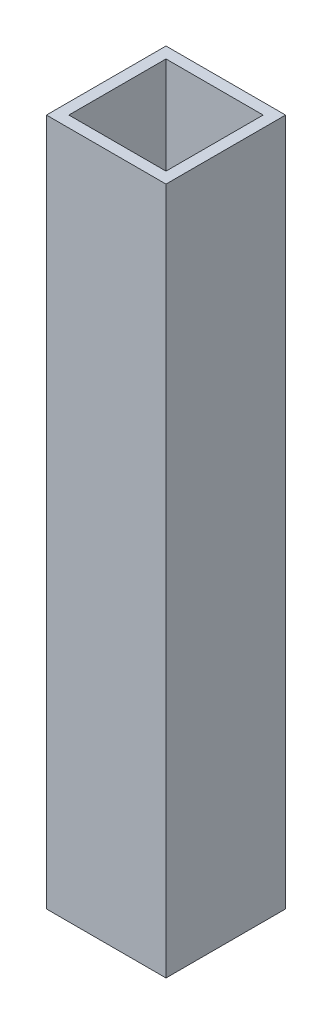
ISO-10303-21;
HEADER;
FILE_DESCRIPTION(('STEP AP214'),'2;1');
FILE_NAME('part.step','',(''),(''),'','','');
FILE_SCHEMA(('AUTOMOTIVE_DESIGN { 1 0 10303 214 1 1 1 1 }'));
ENDSEC;
DATA;
#1=APPLICATION_CONTEXT('core data for automotive mechanical design processes');
#2=APPLICATION_PROTOCOL_DEFINITION('international standard','automotive_design',2000,#1);
#3=PRODUCT_CONTEXT('',#1,'mechanical');
#4=PRODUCT('Part','Part','',(#3));
#5=PRODUCT_RELATED_PRODUCT_CATEGORY('part','',(#4));
#6=PRODUCT_DEFINITION_FORMATION('','',#4);
#7=PRODUCT_DEFINITION_CONTEXT('part definition',#1,'design');
#8=PRODUCT_DEFINITION('design','',#6,#7);
#9=PRODUCT_DEFINITION_SHAPE('','',#8);
#10=(LENGTH_UNIT() NAMED_UNIT(*) SI_UNIT(.MILLI.,.METRE.));
#11=(NAMED_UNIT(*) PLANE_ANGLE_UNIT() SI_UNIT($,.RADIAN.));
#12=(NAMED_UNIT(*) SI_UNIT($,.STERADIAN.) SOLID_ANGLE_UNIT());
#13=UNCERTAINTY_MEASURE_WITH_UNIT(LENGTH_MEASURE(1.E-05),#10,'distance_accuracy_value','');
#14=(GEOMETRIC_REPRESENTATION_CONTEXT(3) GLOBAL_UNCERTAINTY_ASSIGNED_CONTEXT((#13)) GLOBAL_UNIT_ASSIGNED_CONTEXT((#10,
#11,#12)) REPRESENTATION_CONTEXT('',''));
#15=CARTESIAN_POINT('',(0.,0.,0.));
#16=DIRECTION('',(0.,0.,1.));
#17=DIRECTION('',(1.,0.,0.));
#18=AXIS2_PLACEMENT_3D('',#15,#16,#17);
#19=CARTESIAN_POINT('',(25.4,146.05,50.8));
#20=DIRECTION('',(-1.,0.,0.));
#21=DIRECTION('',(0.,-1.,0.));
#22=AXIS2_PLACEMENT_3D('',#19,#20,#21);
#23=PLANE('',#22);
#24=DIRECTION('',(0.,1.,0.));
#25=VECTOR('',#24,1.);
#26=CARTESIAN_POINT('',(25.4,146.05,0.));
#27=LINE('',#26,#25);
#28=CARTESIAN_POINT('',(25.4,-146.05,0.));
#29=VERTEX_POINT('',#28);
#30=CARTESIAN_POINT('',(25.4,146.05,0.));
#31=VERTEX_POINT('',#30);
#32=EDGE_CURVE('E95',#29,#31,#27,.T.);
#33=ORIENTED_EDGE('',*,*,#32,.T.);
#34=DIRECTION('',(0.,0.,-1.));
#35=VECTOR('',#34,1.);
#36=CARTESIAN_POINT('',(25.4,146.05,50.8));
#37=LINE('',#36,#35);
#38=CARTESIAN_POINT('',(25.4,146.05,50.8));
#39=VERTEX_POINT('',#38);
#40=EDGE_CURVE('E11',#39,#31,#37,.T.);
#41=ORIENTED_EDGE('',*,*,#40,.F.);
#42=DIRECTION('',(0.,1.,0.));
#43=VECTOR('',#42,1.);
#44=CARTESIAN_POINT('',(25.4,146.05,50.8));
#45=LINE('',#44,#43);
#46=CARTESIAN_POINT('',(25.4,-146.05,50.8));
#47=VERTEX_POINT('',#46);
#48=EDGE_CURVE('E118',#47,#39,#45,.T.);
#49=ORIENTED_EDGE('',*,*,#48,.F.);
#50=DIRECTION('',(0.,0.,-1.));
#51=VECTOR('',#50,1.);
#52=CARTESIAN_POINT('',(25.4,-146.05,50.8));
#53=LINE('',#52,#51);
#54=EDGE_CURVE('E128',#47,#29,#53,.T.);
#55=ORIENTED_EDGE('',*,*,#54,.T.);
#56=EDGE_LOOP('',(#33,#41,#49,#55));
#57=FACE_BOUND('',#56,.T.);
#58=ADVANCED_FACE('F17',(#57),#23,.F.);
#59=CARTESIAN_POINT('',(-25.4,146.05,50.8));
#60=DIRECTION('',(0.,-1.,0.));
#61=DIRECTION('',(0.,0.,-1.));
#62=AXIS2_PLACEMENT_3D('',#59,#60,#61);
#63=PLANE('',#62);
#64=DIRECTION('',(0.,0.,-1.));
#65=VECTOR('',#64,1.);
#66=CARTESIAN_POINT('',(20.6375,146.05,46.0375));
#67=LINE('',#66,#65);
#68=CARTESIAN_POINT('',(20.6375,146.05,46.0375));
#69=VERTEX_POINT('',#68);
#70=CARTESIAN_POINT('',(20.6375,146.05,4.7625));
#71=VERTEX_POINT('',#70);
#72=EDGE_CURVE('E103',#69,#71,#67,.T.);
#73=ORIENTED_EDGE('',*,*,#72,.F.);
#74=DIRECTION('',(1.,0.,0.));
#75=VECTOR('',#74,1.);
#76=CARTESIAN_POINT('',(-20.6375,146.05,46.0375));
#77=LINE('',#76,#75);
#78=CARTESIAN_POINT('',(-20.6375,146.05,46.0375));
#79=VERTEX_POINT('',#78);
#80=EDGE_CURVE('E31',#79,#69,#77,.T.);
#81=ORIENTED_EDGE('',*,*,#80,.F.);
#82=DIRECTION('',(0.,0.,1.));
#83=VECTOR('',#82,1.);
#84=CARTESIAN_POINT('',(-20.6375,146.05,4.7625));
#85=LINE('',#84,#83);
#86=CARTESIAN_POINT('',(-20.6375,146.05,4.7625));
#87=VERTEX_POINT('',#86);
#88=EDGE_CURVE('E89',#87,#79,#85,.T.);
#89=ORIENTED_EDGE('',*,*,#88,.F.);
#90=DIRECTION('',(-1.,0.,0.));
#91=VECTOR('',#90,1.);
#92=CARTESIAN_POINT('',(20.6375,146.05,4.7625));
#93=LINE('',#92,#91);
#94=EDGE_CURVE('E109',#71,#87,#93,.T.);
#95=ORIENTED_EDGE('',*,*,#94,.F.);
#96=EDGE_LOOP('',(#73,#81,#89,#95));
#97=FACE_BOUND('',#96,.T.);
#98=DIRECTION('',(-1.,0.,0.));
#99=VECTOR('',#98,1.);
#100=CARTESIAN_POINT('',(-25.4,146.05,0.));
#101=LINE('',#100,#99);
#102=CARTESIAN_POINT('',(-25.4,146.05,0.));
#103=VERTEX_POINT('',#102);
#104=EDGE_CURVE('E131',#31,#103,#101,.T.);
#105=ORIENTED_EDGE('',*,*,#104,.T.);
#106=DIRECTION('',(0.,0.,-1.));
#107=VECTOR('',#106,1.);
#108=CARTESIAN_POINT('',(-25.4,146.05,50.8));
#109=LINE('',#108,#107);
#110=CARTESIAN_POINT('',(-25.4,146.05,50.8));
#111=VERTEX_POINT('',#110);
#112=EDGE_CURVE('E24',#111,#103,#109,.T.);
#113=ORIENTED_EDGE('',*,*,#112,.F.);
#114=DIRECTION('',(-1.,0.,0.));
#115=VECTOR('',#114,1.);
#116=CARTESIAN_POINT('',(-25.4,146.05,50.8));
#117=LINE('',#116,#115);
#118=EDGE_CURVE('E121',#39,#111,#117,.T.);
#119=ORIENTED_EDGE('',*,*,#118,.F.);
#120=ORIENTED_EDGE('',*,*,#40,.T.);
#121=EDGE_LOOP('',(#105,#113,#119,#120));
#122=FACE_BOUND('',#121,.T.);
#123=ADVANCED_FACE('F159',(#97,#122),#63,.F.);
#124=CARTESIAN_POINT('',(-25.4,146.05,50.8));
#125=DIRECTION('',(1.,0.,0.));
#126=DIRECTION('',(0.,1.,0.));
#127=AXIS2_PLACEMENT_3D('',#124,#125,#126);
#128=PLANE('',#127);
#129=DIRECTION('',(0.,-1.,0.));
#130=VECTOR('',#129,1.);
#131=CARTESIAN_POINT('',(-25.4,146.05,0.));
#132=LINE('',#131,#130);
#133=CARTESIAN_POINT('',(-25.4,-146.05,0.));
#134=VERTEX_POINT('',#133);
#135=EDGE_CURVE('E133',#103,#134,#132,.T.);
#136=ORIENTED_EDGE('',*,*,#135,.T.);
#137=DIRECTION('',(0.,0.,-1.));
#138=VECTOR('',#137,1.);
#139=CARTESIAN_POINT('',(-25.4,-146.05,50.8));
#140=LINE('',#139,#138);
#141=CARTESIAN_POINT('',(-25.4,-146.05,50.8));
#142=VERTEX_POINT('',#141);
#143=EDGE_CURVE('E138',#142,#134,#140,.T.);
#144=ORIENTED_EDGE('',*,*,#143,.F.);
#145=DIRECTION('',(0.,-1.,0.));
#146=VECTOR('',#145,1.);
#147=CARTESIAN_POINT('',(-25.4,146.05,50.8));
#148=LINE('',#147,#146);
#149=EDGE_CURVE('E124',#111,#142,#148,.T.);
#150=ORIENTED_EDGE('',*,*,#149,.F.);
#151=ORIENTED_EDGE('',*,*,#112,.T.);
#152=EDGE_LOOP('',(#136,#144,#150,#151));
#153=FACE_BOUND('',#152,.T.);
#154=ADVANCED_FACE('F145',(#153),#128,.F.);
#155=CARTESIAN_POINT('',(-25.4,-146.05,50.8));
#156=DIRECTION('',(0.,1.,0.));
#157=DIRECTION('',(0.,0.,1.));
#158=AXIS2_PLACEMENT_3D('',#155,#156,#157);
#159=PLANE('',#158);
#160=DIRECTION('',(0.,0.,-1.));
#161=VECTOR('',#160,1.);
#162=CARTESIAN_POINT('',(-20.6375,-146.05,4.7625));
#163=LINE('',#162,#161);
#164=CARTESIAN_POINT('',(-20.6375,-146.05,46.0375));
#165=VERTEX_POINT('',#164);
#166=CARTESIAN_POINT('',(-20.6375,-146.05,4.7625));
#167=VERTEX_POINT('',#166);
#168=EDGE_CURVE('E101',#165,#167,#163,.T.);
#169=ORIENTED_EDGE('',*,*,#168,.F.);
#170=DIRECTION('',(-1.,0.,0.));
#171=VECTOR('',#170,1.);
#172=CARTESIAN_POINT('',(-20.6375,-146.05,46.0375));
#173=LINE('',#172,#171);
#174=CARTESIAN_POINT('',(20.6375,-146.05,46.0375));
#175=VERTEX_POINT('',#174);
#176=EDGE_CURVE('E83',#175,#165,#173,.T.);
#177=ORIENTED_EDGE('',*,*,#176,.F.);
#178=DIRECTION('',(0.,0.,1.));
#179=VECTOR('',#178,1.);
#180=CARTESIAN_POINT('',(20.6375,-146.05,46.0375));
#181=LINE('',#180,#179);
#182=CARTESIAN_POINT('',(20.6375,-146.05,4.7625));
#183=VERTEX_POINT('',#182);
#184=EDGE_CURVE('E92',#183,#175,#181,.T.);
#185=ORIENTED_EDGE('',*,*,#184,.F.);
#186=DIRECTION('',(1.,0.,0.));
#187=VECTOR('',#186,1.);
#188=CARTESIAN_POINT('',(20.6375,-146.05,4.7625));
#189=LINE('',#188,#187);
#190=EDGE_CURVE('E39',#167,#183,#189,.T.);
#191=ORIENTED_EDGE('',*,*,#190,.F.);
#192=EDGE_LOOP('',(#169,#177,#185,#191));
#193=FACE_BOUND('',#192,.T.);
#194=DIRECTION('',(1.,0.,0.));
#195=VECTOR('',#194,1.);
#196=CARTESIAN_POINT('',(-25.4,-146.05,0.));
#197=LINE('',#196,#195);
#198=EDGE_CURVE('E122',#134,#29,#197,.T.);
#199=ORIENTED_EDGE('',*,*,#198,.T.);
#200=ORIENTED_EDGE('',*,*,#54,.F.);
#201=DIRECTION('',(1.,0.,0.));
#202=VECTOR('',#201,1.);
#203=CARTESIAN_POINT('',(-25.4,-146.05,50.8));
#204=LINE('',#203,#202);
#205=EDGE_CURVE('E126',#142,#47,#204,.T.);
#206=ORIENTED_EDGE('',*,*,#205,.F.);
#207=ORIENTED_EDGE('',*,*,#143,.T.);
#208=EDGE_LOOP('',(#199,#200,#206,#207));
#209=FACE_BOUND('',#208,.T.);
#210=ADVANCED_FACE('F98',(#193,#209),#159,.F.);
#211=CARTESIAN_POINT('',(25.4,-146.05,50.8));
#212=DIRECTION('',(0.,0.,1.));
#213=DIRECTION('',(1.,0.,0.));
#214=AXIS2_PLACEMENT_3D('',#211,#212,#213);
#215=PLANE('',#214);
#216=ORIENTED_EDGE('',*,*,#48,.T.);
#217=ORIENTED_EDGE('',*,*,#118,.T.);
#218=ORIENTED_EDGE('',*,*,#149,.T.);
#219=ORIENTED_EDGE('',*,*,#205,.T.);
#220=EDGE_LOOP('',(#216,#217,#218,#219));
#221=FACE_BOUND('',#220,.T.);
#222=ADVANCED_FACE('F158',(#221),#215,.T.);
#223=CARTESIAN_POINT('',(25.4,-146.05,0.));
#224=DIRECTION('',(0.,0.,1.));
#225=DIRECTION('',(1.,0.,0.));
#226=AXIS2_PLACEMENT_3D('',#223,#224,#225);
#227=PLANE('',#226);
#228=ORIENTED_EDGE('',*,*,#32,.F.);
#229=ORIENTED_EDGE('',*,*,#198,.F.);
#230=ORIENTED_EDGE('',*,*,#135,.F.);
#231=ORIENTED_EDGE('',*,*,#104,.F.);
#232=EDGE_LOOP('',(#228,#229,#230,#231));
#233=FACE_BOUND('',#232,.T.);
#234=ADVANCED_FACE('F151',(#233),#227,.F.);
#235=CARTESIAN_POINT('',(-20.6375,-146.051,46.0375));
#236=DIRECTION('',(0.,0.,1.));
#237=DIRECTION('',(1.,0.,0.));
#238=AXIS2_PLACEMENT_3D('',#235,#236,#237);
#239=PLANE('',#238);
#240=ORIENTED_EDGE('',*,*,#176,.T.);
#241=DIRECTION('',(0.,1.,0.));
#242=VECTOR('',#241,1.);
#243=CARTESIAN_POINT('',(-20.6375,-146.051,46.0375));
#244=LINE('',#243,#242);
#245=EDGE_CURVE('E96',#165,#79,#244,.T.);
#246=ORIENTED_EDGE('',*,*,#245,.T.);
#247=ORIENTED_EDGE('',*,*,#80,.T.);
#248=DIRECTION('',(0.,1.,0.));
#249=VECTOR('',#248,1.);
#250=CARTESIAN_POINT('',(20.6375,-146.051,46.0375));
#251=LINE('',#250,#249);
#252=EDGE_CURVE('E79',#175,#69,#251,.T.);
#253=ORIENTED_EDGE('',*,*,#252,.F.);
#254=EDGE_LOOP('',(#240,#246,#247,#253));
#255=FACE_BOUND('',#254,.T.);
#256=ADVANCED_FACE('F81',(#255),#239,.F.);
#257=CARTESIAN_POINT('',(-20.6375,-146.051,4.7625));
#258=DIRECTION('',(-1.,0.,0.));
#259=DIRECTION('',(0.,0.,1.));
#260=AXIS2_PLACEMENT_3D('',#257,#258,#259);
#261=PLANE('',#260);
#262=ORIENTED_EDGE('',*,*,#168,.T.);
#263=DIRECTION('',(0.,1.,0.));
#264=VECTOR('',#263,1.);
#265=CARTESIAN_POINT('',(-20.6375,-146.051,4.7625));
#266=LINE('',#265,#264);
#267=EDGE_CURVE('E115',#167,#87,#266,.T.);
#268=ORIENTED_EDGE('',*,*,#267,.T.);
#269=ORIENTED_EDGE('',*,*,#88,.T.);
#270=ORIENTED_EDGE('',*,*,#245,.F.);
#271=EDGE_LOOP('',(#262,#268,#269,#270));
#272=FACE_BOUND('',#271,.T.);
#273=ADVANCED_FACE('F178',(#272),#261,.F.);
#274=CARTESIAN_POINT('',(20.6375,-146.051,4.7625));
#275=DIRECTION('',(0.,0.,-1.));
#276=DIRECTION('',(-1.,0.,0.));
#277=AXIS2_PLACEMENT_3D('',#274,#275,#276);
#278=PLANE('',#277);
#279=ORIENTED_EDGE('',*,*,#190,.T.);
#280=DIRECTION('',(0.,1.,0.));
#281=VECTOR('',#280,1.);
#282=CARTESIAN_POINT('',(20.6375,-146.051,4.7625));
#283=LINE('',#282,#281);
#284=EDGE_CURVE('E88',#183,#71,#283,.T.);
#285=ORIENTED_EDGE('',*,*,#284,.T.);
#286=ORIENTED_EDGE('',*,*,#94,.T.);
#287=ORIENTED_EDGE('',*,*,#267,.F.);
#288=EDGE_LOOP('',(#279,#285,#286,#287));
#289=FACE_BOUND('',#288,.T.);
#290=ADVANCED_FACE('F181',(#289),#278,.F.);
#291=CARTESIAN_POINT('',(20.6375,-146.051,46.0375));
#292=DIRECTION('',(1.,0.,0.));
#293=DIRECTION('',(0.,0.,-1.));
#294=AXIS2_PLACEMENT_3D('',#291,#292,#293);
#295=PLANE('',#294);
#296=ORIENTED_EDGE('',*,*,#184,.T.);
#297=ORIENTED_EDGE('',*,*,#252,.T.);
#298=ORIENTED_EDGE('',*,*,#72,.T.);
#299=ORIENTED_EDGE('',*,*,#284,.F.);
#300=EDGE_LOOP('',(#296,#297,#298,#299));
#301=FACE_BOUND('',#300,.T.);
#302=ADVANCED_FACE('F93',(#301),#295,.F.);
#303=CLOSED_SHELL('',(#58,#123,#154,#210,#222,#234,#256,#273,#290,#302));
#304=MANIFOLD_SOLID_BREP('B1',#303);
#305=ADVANCED_BREP_SHAPE_REPRESENTATION('',(#18,#304),#14);
#306=SHAPE_DEFINITION_REPRESENTATION(#9,#305);
ENDSEC;
END-ISO-10303-21;
